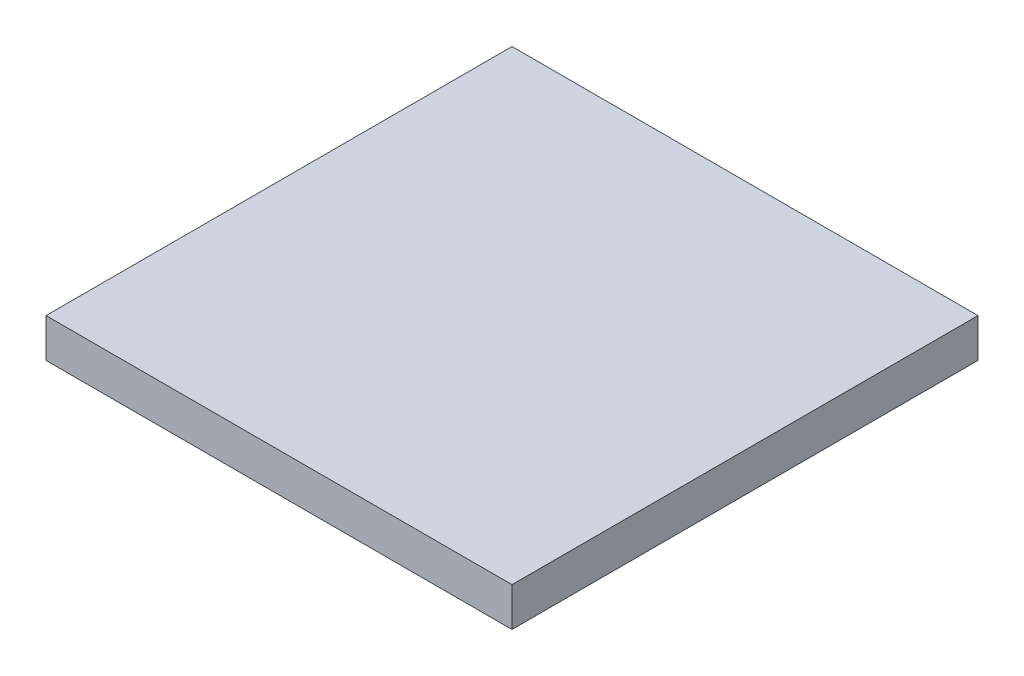
ISO-10303-21;
HEADER;
FILE_DESCRIPTION(('STEP AP214'),'2;1');
FILE_NAME('part.step','',(''),(''),'','','');
FILE_SCHEMA(('AUTOMOTIVE_DESIGN { 1 0 10303 214 1 1 1 1 }'));
ENDSEC;
DATA;
#1=APPLICATION_CONTEXT('core data for automotive mechanical design processes');
#2=APPLICATION_PROTOCOL_DEFINITION('international standard','automotive_design',2000,#1);
#3=PRODUCT_CONTEXT('',#1,'mechanical');
#4=PRODUCT('Part','Part','',(#3));
#5=PRODUCT_RELATED_PRODUCT_CATEGORY('part','',(#4));
#6=PRODUCT_DEFINITION_FORMATION('','',#4);
#7=PRODUCT_DEFINITION_CONTEXT('part definition',#1,'design');
#8=PRODUCT_DEFINITION('design','',#6,#7);
#9=PRODUCT_DEFINITION_SHAPE('','',#8);
#10=(LENGTH_UNIT() NAMED_UNIT(*) SI_UNIT(.MILLI.,.METRE.));
#11=(NAMED_UNIT(*) PLANE_ANGLE_UNIT() SI_UNIT($,.RADIAN.));
#12=(NAMED_UNIT(*) SI_UNIT($,.STERADIAN.) SOLID_ANGLE_UNIT());
#13=UNCERTAINTY_MEASURE_WITH_UNIT(LENGTH_MEASURE(1.E-05),#10,'distance_accuracy_value','');
#14=(GEOMETRIC_REPRESENTATION_CONTEXT(3) GLOBAL_UNCERTAINTY_ASSIGNED_CONTEXT((#13)) GLOBAL_UNIT_ASSIGNED_CONTEXT((#10,
#11,#12)) REPRESENTATION_CONTEXT('',''));
#15=CARTESIAN_POINT('',(0.,0.,0.));
#16=DIRECTION('',(0.,0.,1.));
#17=DIRECTION('',(1.,0.,0.));
#18=AXIS2_PLACEMENT_3D('',#15,#16,#17);
#19=CARTESIAN_POINT('',(38.1,6.35,38.1));
#20=DIRECTION('',(-1.,0.,0.));
#21=DIRECTION('',(0.,0.,1.));
#22=AXIS2_PLACEMENT_3D('',#19,#20,#21);
#23=PLANE('',#22);
#24=DIRECTION('',(0.,0.,-1.));
#25=VECTOR('',#24,1.);
#26=CARTESIAN_POINT('',(38.1,0.,38.1));
#27=LINE('',#26,#25);
#28=CARTESIAN_POINT('',(38.1,0.,38.1));
#29=VERTEX_POINT('',#28);
#30=CARTESIAN_POINT('',(38.1,0.,-38.1));
#31=VERTEX_POINT('',#30);
#32=EDGE_CURVE('E113',#29,#31,#27,.T.);
#33=ORIENTED_EDGE('',*,*,#32,.T.);
#34=DIRECTION('',(0.,-1.,0.));
#35=VECTOR('',#34,1.);
#36=CARTESIAN_POINT('',(38.1,6.35,-38.1));
#37=LINE('',#36,#35);
#38=CARTESIAN_POINT('',(38.1,6.35,-38.1));
#39=VERTEX_POINT('',#38);
#40=EDGE_CURVE('E11',#39,#31,#37,.T.);
#41=ORIENTED_EDGE('',*,*,#40,.F.);
#42=DIRECTION('',(0.,0.,-1.));
#43=VECTOR('',#42,1.);
#44=CARTESIAN_POINT('',(38.1,6.35,38.1));
#45=LINE('',#44,#43);
#46=CARTESIAN_POINT('',(38.1,6.35,38.1));
#47=VERTEX_POINT('',#46);
#48=EDGE_CURVE('E97',#47,#39,#45,.T.);
#49=ORIENTED_EDGE('',*,*,#48,.F.);
#50=DIRECTION('',(0.,-1.,0.));
#51=VECTOR('',#50,1.);
#52=CARTESIAN_POINT('',(38.1,6.35,38.1));
#53=LINE('',#52,#51);
#54=EDGE_CURVE('E109',#47,#29,#53,.T.);
#55=ORIENTED_EDGE('',*,*,#54,.T.);
#56=EDGE_LOOP('',(#33,#41,#49,#55));
#57=FACE_BOUND('',#56,.T.);
#58=ADVANCED_FACE('F45',(#57),#23,.F.);
#59=CARTESIAN_POINT('',(-38.1,6.35,-38.1));
#60=DIRECTION('',(0.,0.,1.));
#61=DIRECTION('',(1.,0.,0.));
#62=AXIS2_PLACEMENT_3D('',#59,#60,#61);
#63=PLANE('',#62);
#64=DIRECTION('',(-1.,0.,0.));
#65=VECTOR('',#64,1.);
#66=CARTESIAN_POINT('',(-38.1,0.,-38.1));
#67=LINE('',#66,#65);
#68=CARTESIAN_POINT('',(-38.1,0.,-38.1));
#69=VERTEX_POINT('',#68);
#70=EDGE_CURVE('E102',#31,#69,#67,.T.);
#71=ORIENTED_EDGE('',*,*,#70,.T.);
#72=DIRECTION('',(0.,-1.,0.));
#73=VECTOR('',#72,1.);
#74=CARTESIAN_POINT('',(-38.1,6.35,-38.1));
#75=LINE('',#74,#73);
#76=CARTESIAN_POINT('',(-38.1,6.35,-38.1));
#77=VERTEX_POINT('',#76);
#78=EDGE_CURVE('E54',#77,#69,#75,.T.);
#79=ORIENTED_EDGE('',*,*,#78,.F.);
#80=DIRECTION('',(-1.,0.,0.));
#81=VECTOR('',#80,1.);
#82=CARTESIAN_POINT('',(-38.1,6.35,-38.1));
#83=LINE('',#82,#81);
#84=EDGE_CURVE('E92',#39,#77,#83,.T.);
#85=ORIENTED_EDGE('',*,*,#84,.F.);
#86=ORIENTED_EDGE('',*,*,#40,.T.);
#87=EDGE_LOOP('',(#71,#79,#85,#86));
#88=FACE_BOUND('',#87,.T.);
#89=ADVANCED_FACE('F101',(#88),#63,.F.);
#90=CARTESIAN_POINT('',(-38.1,6.35,38.1));
#91=DIRECTION('',(1.,0.,0.));
#92=DIRECTION('',(0.,0.,-1.));
#93=AXIS2_PLACEMENT_3D('',#90,#91,#92);
#94=PLANE('',#93);
#95=DIRECTION('',(0.,0.,1.));
#96=VECTOR('',#95,1.);
#97=CARTESIAN_POINT('',(-38.1,0.,38.1));
#98=LINE('',#97,#96);
#99=CARTESIAN_POINT('',(-38.1,0.,38.1));
#100=VERTEX_POINT('',#99);
#101=EDGE_CURVE('E79',#69,#100,#98,.T.);
#102=ORIENTED_EDGE('',*,*,#101,.T.);
#103=DIRECTION('',(0.,-1.,0.));
#104=VECTOR('',#103,1.);
#105=CARTESIAN_POINT('',(-38.1,6.35,38.1));
#106=LINE('',#105,#104);
#107=CARTESIAN_POINT('',(-38.1,6.35,38.1));
#108=VERTEX_POINT('',#107);
#109=EDGE_CURVE('E104',#108,#100,#106,.T.);
#110=ORIENTED_EDGE('',*,*,#109,.F.);
#111=DIRECTION('',(0.,0.,1.));
#112=VECTOR('',#111,1.);
#113=CARTESIAN_POINT('',(-38.1,6.35,38.1));
#114=LINE('',#113,#112);
#115=EDGE_CURVE('E95',#77,#108,#114,.T.);
#116=ORIENTED_EDGE('',*,*,#115,.F.);
#117=ORIENTED_EDGE('',*,*,#78,.T.);
#118=EDGE_LOOP('',(#102,#110,#116,#117));
#119=FACE_BOUND('',#118,.T.);
#120=ADVANCED_FACE('F105',(#119),#94,.F.);
#121=CARTESIAN_POINT('',(-38.1,6.35,38.1));
#122=DIRECTION('',(0.,0.,-1.));
#123=DIRECTION('',(-1.,0.,0.));
#124=AXIS2_PLACEMENT_3D('',#121,#122,#123);
#125=PLANE('',#124);
#126=DIRECTION('',(1.,0.,0.));
#127=VECTOR('',#126,1.);
#128=CARTESIAN_POINT('',(-38.1,0.,38.1));
#129=LINE('',#128,#127);
#130=EDGE_CURVE('E85',#100,#29,#129,.T.);
#131=ORIENTED_EDGE('',*,*,#130,.T.);
#132=ORIENTED_EDGE('',*,*,#54,.F.);
#133=DIRECTION('',(1.,0.,0.));
#134=VECTOR('',#133,1.);
#135=CARTESIAN_POINT('',(-38.1,6.35,38.1));
#136=LINE('',#135,#134);
#137=EDGE_CURVE('E62',#108,#47,#136,.T.);
#138=ORIENTED_EDGE('',*,*,#137,.F.);
#139=ORIENTED_EDGE('',*,*,#109,.T.);
#140=EDGE_LOOP('',(#131,#132,#138,#139));
#141=FACE_BOUND('',#140,.T.);
#142=ADVANCED_FACE('F126',(#141),#125,.F.);
#143=CARTESIAN_POINT('',(0.,6.35,0.));
#144=DIRECTION('',(0.,-1.,0.));
#145=DIRECTION('',(0.,0.,-1.));
#146=AXIS2_PLACEMENT_3D('',#143,#144,#145);
#147=PLANE('',#146);
#148=ORIENTED_EDGE('',*,*,#48,.T.);
#149=ORIENTED_EDGE('',*,*,#84,.T.);
#150=ORIENTED_EDGE('',*,*,#115,.T.);
#151=ORIENTED_EDGE('',*,*,#137,.T.);
#152=EDGE_LOOP('',(#148,#149,#150,#151));
#153=FACE_BOUND('',#152,.T.);
#154=ADVANCED_FACE('F93',(#153),#147,.F.);
#155=CARTESIAN_POINT('',(0.,0.,0.));
#156=DIRECTION('',(0.,-1.,0.));
#157=DIRECTION('',(0.,0.,-1.));
#158=AXIS2_PLACEMENT_3D('',#155,#156,#157);
#159=PLANE('',#158);
#160=ORIENTED_EDGE('',*,*,#32,.F.);
#161=ORIENTED_EDGE('',*,*,#130,.F.);
#162=ORIENTED_EDGE('',*,*,#101,.F.);
#163=ORIENTED_EDGE('',*,*,#70,.F.);
#164=EDGE_LOOP('',(#160,#161,#162,#163));
#165=FACE_BOUND('',#164,.T.);
#166=ADVANCED_FACE('F129',(#165),#159,.T.);
#167=CLOSED_SHELL('',(#58,#89,#120,#142,#154,#166));
#168=MANIFOLD_SOLID_BREP('B2',#167);
#169=ADVANCED_BREP_SHAPE_REPRESENTATION('',(#18,#168),#14);
#170=SHAPE_DEFINITION_REPRESENTATION(#9,#169);
ENDSEC;
END-ISO-10303-21;
